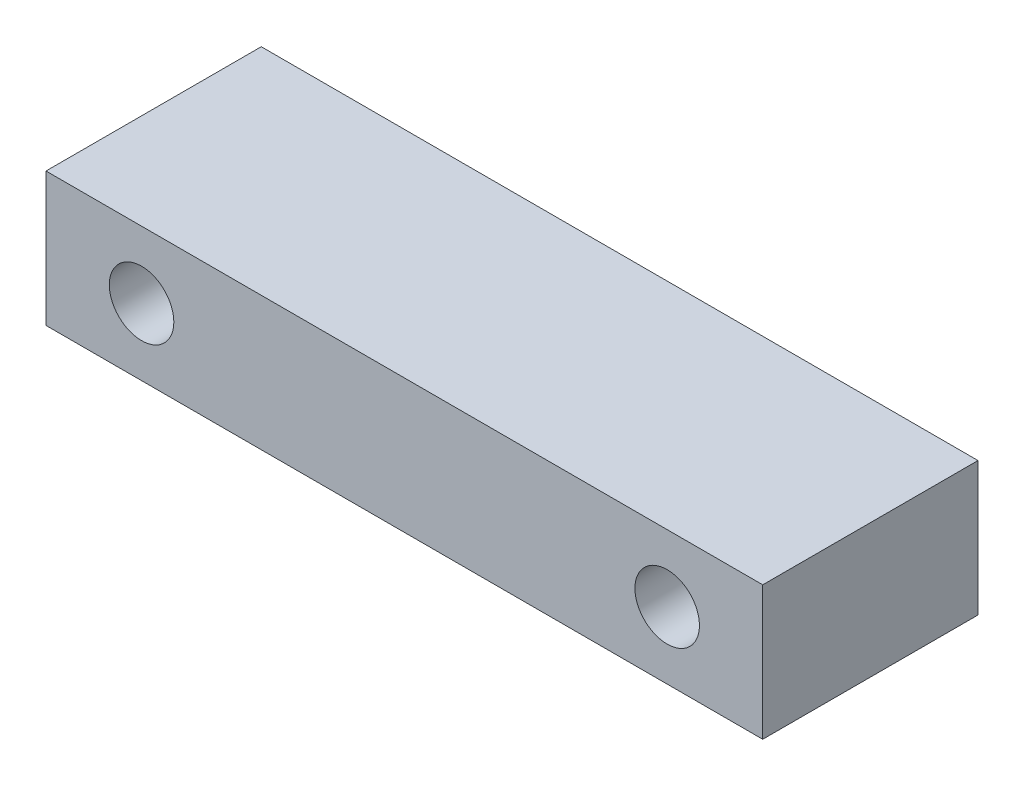
ISO-10303-21;
HEADER;
FILE_DESCRIPTION(('STEP AP214'),'2;1');
FILE_NAME('part.step','',(''),(''),'','','');
FILE_SCHEMA(('AUTOMOTIVE_DESIGN { 1 0 10303 214 1 1 1 1 }'));
ENDSEC;
DATA;
#1=APPLICATION_CONTEXT('core data for automotive mechanical design processes');
#2=APPLICATION_PROTOCOL_DEFINITION('international standard','automotive_design',2000,#1);
#3=PRODUCT_CONTEXT('',#1,'mechanical');
#4=PRODUCT('Part','Part','',(#3));
#5=PRODUCT_RELATED_PRODUCT_CATEGORY('part','',(#4));
#6=PRODUCT_DEFINITION_FORMATION('','',#4);
#7=PRODUCT_DEFINITION_CONTEXT('part definition',#1,'design');
#8=PRODUCT_DEFINITION('design','',#6,#7);
#9=PRODUCT_DEFINITION_SHAPE('','',#8);
#10=(LENGTH_UNIT() NAMED_UNIT(*) SI_UNIT(.MILLI.,.METRE.));
#11=(NAMED_UNIT(*) PLANE_ANGLE_UNIT() SI_UNIT($,.RADIAN.));
#12=(NAMED_UNIT(*) SI_UNIT($,.STERADIAN.) SOLID_ANGLE_UNIT());
#13=UNCERTAINTY_MEASURE_WITH_UNIT(LENGTH_MEASURE(1.E-05),#10,'distance_accuracy_value','');
#14=(GEOMETRIC_REPRESENTATION_CONTEXT(3) GLOBAL_UNCERTAINTY_ASSIGNED_CONTEXT((#13)) GLOBAL_UNIT_ASSIGNED_CONTEXT((#10,
#11,#12)) REPRESENTATION_CONTEXT('',''));
#15=CARTESIAN_POINT('',(0.,0.,0.));
#16=DIRECTION('',(0.,0.,1.));
#17=DIRECTION('',(1.,0.,0.));
#18=AXIS2_PLACEMENT_3D('',#15,#16,#17);
#19=CARTESIAN_POINT('',(0.,0.,9.01));
#20=DIRECTION('',(0.,0.,-1.));
#21=DIRECTION('',(-1.,0.,0.));
#22=AXIS2_PLACEMENT_3D('',#19,#20,#21);
#23=PLANE('',#22);
#24=DIRECTION('',(0.,1.,0.));
#25=VECTOR('',#24,1.);
#26=CARTESIAN_POINT('',(15.,-2.8,9.01));
#27=LINE('',#26,#25);
#28=CARTESIAN_POINT('',(15.,-2.8,9.01));
#29=VERTEX_POINT('',#28);
#30=CARTESIAN_POINT('',(15.,2.8,9.01));
#31=VERTEX_POINT('',#30);
#32=EDGE_CURVE('E86',#29,#31,#27,.T.);
#33=ORIENTED_EDGE('',*,*,#32,.T.);
#34=DIRECTION('',(-1.,0.,0.));
#35=VECTOR('',#34,1.);
#36=CARTESIAN_POINT('',(-15.,2.8,9.01));
#37=LINE('',#36,#35);
#38=CARTESIAN_POINT('',(-15.,2.8,9.01));
#39=VERTEX_POINT('',#38);
#40=EDGE_CURVE('E81',#31,#39,#37,.T.);
#41=ORIENTED_EDGE('',*,*,#40,.T.);
#42=DIRECTION('',(0.,-1.,0.));
#43=VECTOR('',#42,1.);
#44=CARTESIAN_POINT('',(-15.,2.8,9.01));
#45=LINE('',#44,#43);
#46=CARTESIAN_POINT('',(-15.,-2.8,9.01));
#47=VERTEX_POINT('',#46);
#48=EDGE_CURVE('E84',#39,#47,#45,.T.);
#49=ORIENTED_EDGE('',*,*,#48,.T.);
#50=DIRECTION('',(1.,0.,0.));
#51=VECTOR('',#50,1.);
#52=CARTESIAN_POINT('',(-15.,-2.8,9.01));
#53=LINE('',#52,#51);
#54=EDGE_CURVE('E51',#47,#29,#53,.T.);
#55=ORIENTED_EDGE('',*,*,#54,.T.);
#56=EDGE_LOOP('',(#33,#41,#49,#55));
#57=FACE_BOUND('',#56,.T.);
#58=CARTESIAN_POINT('',(-11.,0.,9.01));
#59=DIRECTION('',(0.,0.,1.));
#60=DIRECTION('',(1.,0.,0.));
#61=AXIS2_PLACEMENT_3D('',#58,#59,#60);
#62=CIRCLE('',#61,1.35);
#63=CARTESIAN_POINT('',(-9.65,0.,9.01));
#64=VERTEX_POINT('',#63);
#65=EDGE_CURVE('E101',#64,#64,#62,.T.);
#66=ORIENTED_EDGE('',*,*,#65,.F.);
#67=EDGE_LOOP('',(#66));
#68=FACE_BOUND('',#67,.T.);
#69=CARTESIAN_POINT('',(11.,0.,9.01));
#70=DIRECTION('',(0.,0.,1.));
#71=DIRECTION('',(-1.,0.,0.));
#72=AXIS2_PLACEMENT_3D('',#69,#70,#71);
#73=CIRCLE('',#72,1.35);
#74=CARTESIAN_POINT('',(9.65,0.,9.01));
#75=VERTEX_POINT('',#74);
#76=EDGE_CURVE('E116',#75,#75,#73,.T.);
#77=ORIENTED_EDGE('',*,*,#76,.F.);
#78=EDGE_LOOP('',(#77));
#79=FACE_BOUND('',#78,.T.);
#80=ADVANCED_FACE('F34',(#57,#68,#79),#23,.F.);
#81=CARTESIAN_POINT('',(0.,0.,0.));
#82=DIRECTION('',(0.,0.,-1.));
#83=DIRECTION('',(-1.,0.,0.));
#84=AXIS2_PLACEMENT_3D('',#81,#82,#83);
#85=PLANE('',#84);
#86=CARTESIAN_POINT('',(-11.,0.,0.));
#87=DIRECTION('',(0.,0.,1.));
#88=DIRECTION('',(1.,0.,0.));
#89=AXIS2_PLACEMENT_3D('',#86,#87,#88);
#90=CIRCLE('',#89,1.35);
#91=CARTESIAN_POINT('',(-9.65,0.,0.));
#92=VERTEX_POINT('',#91);
#93=EDGE_CURVE('E113',#92,#92,#90,.T.);
#94=ORIENTED_EDGE('',*,*,#93,.T.);
#95=EDGE_LOOP('',(#94));
#96=FACE_BOUND('',#95,.T.);
#97=DIRECTION('',(0.,1.,0.));
#98=VECTOR('',#97,1.);
#99=CARTESIAN_POINT('',(15.,-2.8,0.));
#100=LINE('',#99,#98);
#101=CARTESIAN_POINT('',(15.,-2.8,0.));
#102=VERTEX_POINT('',#101);
#103=CARTESIAN_POINT('',(15.,2.8,0.));
#104=VERTEX_POINT('',#103);
#105=EDGE_CURVE('E98',#102,#104,#100,.T.);
#106=ORIENTED_EDGE('',*,*,#105,.F.);
#107=DIRECTION('',(1.,0.,0.));
#108=VECTOR('',#107,1.);
#109=CARTESIAN_POINT('',(-15.,-2.8,0.));
#110=LINE('',#109,#108);
#111=CARTESIAN_POINT('',(-15.,-2.8,0.));
#112=VERTEX_POINT('',#111);
#113=EDGE_CURVE('E74',#112,#102,#110,.T.);
#114=ORIENTED_EDGE('',*,*,#113,.F.);
#115=DIRECTION('',(0.,-1.,0.));
#116=VECTOR('',#115,1.);
#117=CARTESIAN_POINT('',(-15.,2.8,0.));
#118=LINE('',#117,#116);
#119=CARTESIAN_POINT('',(-15.,2.8,0.));
#120=VERTEX_POINT('',#119);
#121=EDGE_CURVE('E68',#120,#112,#118,.T.);
#122=ORIENTED_EDGE('',*,*,#121,.F.);
#123=DIRECTION('',(-1.,0.,0.));
#124=VECTOR('',#123,1.);
#125=CARTESIAN_POINT('',(-15.,2.8,0.));
#126=LINE('',#125,#124);
#127=EDGE_CURVE('E90',#104,#120,#126,.T.);
#128=ORIENTED_EDGE('',*,*,#127,.F.);
#129=EDGE_LOOP('',(#106,#114,#122,#128));
#130=FACE_BOUND('',#129,.T.);
#131=CARTESIAN_POINT('',(11.,0.,0.));
#132=DIRECTION('',(0.,0.,1.));
#133=DIRECTION('',(-1.,0.,0.));
#134=AXIS2_PLACEMENT_3D('',#131,#132,#133);
#135=CIRCLE('',#134,1.35);
#136=CARTESIAN_POINT('',(9.65,0.,0.));
#137=VERTEX_POINT('',#136);
#138=EDGE_CURVE('E119',#137,#137,#135,.T.);
#139=ORIENTED_EDGE('',*,*,#138,.T.);
#140=EDGE_LOOP('',(#139));
#141=FACE_BOUND('',#140,.T.);
#142=ADVANCED_FACE('F109',(#96,#130,#141),#85,.T.);
#143=CARTESIAN_POINT('',(15.,-2.8,9.01));
#144=DIRECTION('',(-1.,0.,0.));
#145=DIRECTION('',(0.,0.,1.));
#146=AXIS2_PLACEMENT_3D('',#143,#144,#145);
#147=PLANE('',#146);
#148=ORIENTED_EDGE('',*,*,#105,.T.);
#149=DIRECTION('',(0.,0.,-1.));
#150=VECTOR('',#149,1.);
#151=CARTESIAN_POINT('',(15.,2.8,9.01));
#152=LINE('',#151,#150);
#153=EDGE_CURVE('E11',#31,#104,#152,.T.);
#154=ORIENTED_EDGE('',*,*,#153,.F.);
#155=ORIENTED_EDGE('',*,*,#32,.F.);
#156=DIRECTION('',(0.,0.,-1.));
#157=VECTOR('',#156,1.);
#158=CARTESIAN_POINT('',(15.,-2.8,9.01));
#159=LINE('',#158,#157);
#160=EDGE_CURVE('E94',#29,#102,#159,.T.);
#161=ORIENTED_EDGE('',*,*,#160,.T.);
#162=EDGE_LOOP('',(#148,#154,#155,#161));
#163=FACE_BOUND('',#162,.T.);
#164=ADVANCED_FACE('F36',(#163),#147,.F.);
#165=CARTESIAN_POINT('',(-15.,2.8,9.01));
#166=DIRECTION('',(0.,-1.,0.));
#167=DIRECTION('',(0.,0.,-1.));
#168=AXIS2_PLACEMENT_3D('',#165,#166,#167);
#169=PLANE('',#168);
#170=ORIENTED_EDGE('',*,*,#127,.T.);
#171=DIRECTION('',(0.,0.,-1.));
#172=VECTOR('',#171,1.);
#173=CARTESIAN_POINT('',(-15.,2.8,9.01));
#174=LINE('',#173,#172);
#175=EDGE_CURVE('E43',#39,#120,#174,.T.);
#176=ORIENTED_EDGE('',*,*,#175,.F.);
#177=ORIENTED_EDGE('',*,*,#40,.F.);
#178=ORIENTED_EDGE('',*,*,#153,.T.);
#179=EDGE_LOOP('',(#170,#176,#177,#178));
#180=FACE_BOUND('',#179,.T.);
#181=ADVANCED_FACE('F89',(#180),#169,.F.);
#182=CARTESIAN_POINT('',(-15.,2.8,9.01));
#183=DIRECTION('',(1.,0.,0.));
#184=DIRECTION('',(0.,0.,-1.));
#185=AXIS2_PLACEMENT_3D('',#182,#183,#184);
#186=PLANE('',#185);
#187=ORIENTED_EDGE('',*,*,#121,.T.);
#188=DIRECTION('',(0.,0.,-1.));
#189=VECTOR('',#188,1.);
#190=CARTESIAN_POINT('',(-15.,-2.8,9.01));
#191=LINE('',#190,#189);
#192=EDGE_CURVE('E91',#47,#112,#191,.T.);
#193=ORIENTED_EDGE('',*,*,#192,.F.);
#194=ORIENTED_EDGE('',*,*,#48,.F.);
#195=ORIENTED_EDGE('',*,*,#175,.T.);
#196=EDGE_LOOP('',(#187,#193,#194,#195));
#197=FACE_BOUND('',#196,.T.);
#198=ADVANCED_FACE('F92',(#197),#186,.F.);
#199=CARTESIAN_POINT('',(-15.,-2.8,9.01));
#200=DIRECTION('',(0.,1.,0.));
#201=DIRECTION('',(0.,0.,1.));
#202=AXIS2_PLACEMENT_3D('',#199,#200,#201);
#203=PLANE('',#202);
#204=ORIENTED_EDGE('',*,*,#113,.T.);
#205=ORIENTED_EDGE('',*,*,#160,.F.);
#206=ORIENTED_EDGE('',*,*,#54,.F.);
#207=ORIENTED_EDGE('',*,*,#192,.T.);
#208=EDGE_LOOP('',(#204,#205,#206,#207));
#209=FACE_BOUND('',#208,.T.);
#210=ADVANCED_FACE('F106',(#209),#203,.F.);
#211=CARTESIAN_POINT('',(-11.,0.,9.01));
#212=DIRECTION('',(0.,0.,-1.));
#213=DIRECTION('',(-1.,0.,0.));
#214=AXIS2_PLACEMENT_3D('',#211,#212,#213);
#215=CYLINDRICAL_SURFACE('',#214,1.35);
#216=ORIENTED_EDGE('',*,*,#65,.T.);
#217=EDGE_LOOP('',(#216));
#218=FACE_BOUND('',#217,.T.);
#219=ORIENTED_EDGE('',*,*,#93,.F.);
#220=EDGE_LOOP('',(#219));
#221=FACE_BOUND('',#220,.T.);
#222=ADVANCED_FACE('F136',(#218,#221),#215,.F.);
#223=CARTESIAN_POINT('',(11.,0.,9.01));
#224=DIRECTION('',(0.,0.,-1.));
#225=DIRECTION('',(-1.,0.,0.));
#226=AXIS2_PLACEMENT_3D('',#223,#224,#225);
#227=CYLINDRICAL_SURFACE('',#226,1.35);
#228=ORIENTED_EDGE('',*,*,#76,.T.);
#229=EDGE_LOOP('',(#228));
#230=FACE_BOUND('',#229,.T.);
#231=ORIENTED_EDGE('',*,*,#138,.F.);
#232=EDGE_LOOP('',(#231));
#233=FACE_BOUND('',#232,.T.);
#234=ADVANCED_FACE('F125',(#230,#233),#227,.F.);
#235=CLOSED_SHELL('',(#80,#142,#164,#181,#198,#210,#222,#234));
#236=MANIFOLD_SOLID_BREP('B2',#235);
#237=ADVANCED_BREP_SHAPE_REPRESENTATION('',(#18,#236),#14);
#238=SHAPE_DEFINITION_REPRESENTATION(#9,#237);
ENDSEC;
END-ISO-10303-21;
